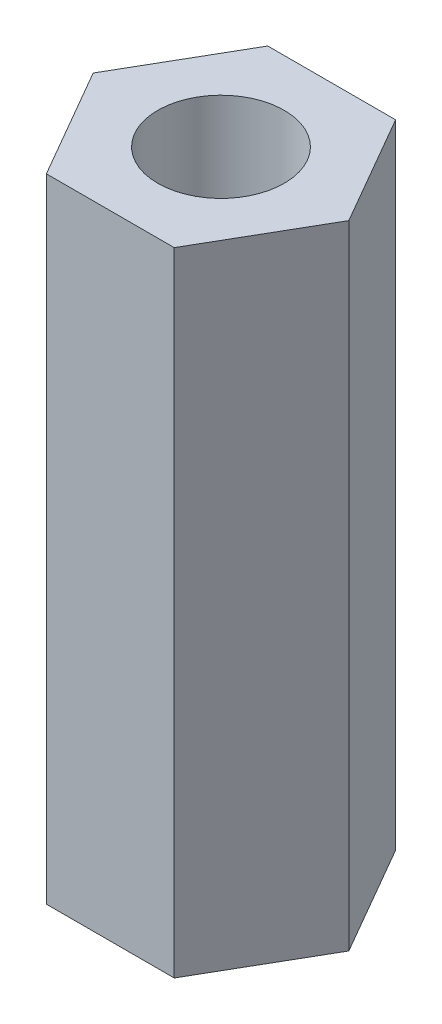
ISO-10303-21;
HEADER;
FILE_DESCRIPTION(('STEP AP214'),'2;1');
FILE_NAME('part.step','',(''),(''),'','','');
FILE_SCHEMA(('AUTOMOTIVE_DESIGN { 1 0 10303 214 1 1 1 1 }'));
ENDSEC;
DATA;
#1=APPLICATION_CONTEXT('core data for automotive mechanical design processes');
#2=APPLICATION_PROTOCOL_DEFINITION('international standard','automotive_design',2000,#1);
#3=PRODUCT_CONTEXT('',#1,'mechanical');
#4=PRODUCT('Part','Part','',(#3));
#5=PRODUCT_RELATED_PRODUCT_CATEGORY('part','',(#4));
#6=PRODUCT_DEFINITION_FORMATION('','',#4);
#7=PRODUCT_DEFINITION_CONTEXT('part definition',#1,'design');
#8=PRODUCT_DEFINITION('design','',#6,#7);
#9=PRODUCT_DEFINITION_SHAPE('','',#8);
#10=(LENGTH_UNIT() NAMED_UNIT(*) SI_UNIT(.MILLI.,.METRE.));
#11=(NAMED_UNIT(*) PLANE_ANGLE_UNIT() SI_UNIT($,.RADIAN.));
#12=(NAMED_UNIT(*) SI_UNIT($,.STERADIAN.) SOLID_ANGLE_UNIT());
#13=UNCERTAINTY_MEASURE_WITH_UNIT(LENGTH_MEASURE(1.E-05),#10,'distance_accuracy_value','');
#14=(GEOMETRIC_REPRESENTATION_CONTEXT(3) GLOBAL_UNCERTAINTY_ASSIGNED_CONTEXT((#13)) GLOBAL_UNIT_ASSIGNED_CONTEXT((#10,
#11,#12)) REPRESENTATION_CONTEXT('',''));
#15=CARTESIAN_POINT('',(0.,0.,0.));
#16=DIRECTION('',(0.,0.,1.));
#17=DIRECTION('',(1.,0.,0.));
#18=AXIS2_PLACEMENT_3D('',#15,#16,#17);
#19=CARTESIAN_POINT('',(0.,20.,0.));
#20=DIRECTION('',(0.,1.,0.));
#21=DIRECTION('',(0.,0.,1.));
#22=AXIS2_PLACEMENT_3D('',#19,#20,#21);
#23=PLANE('',#22);
#24=DIRECTION('',(-0.5,0.,-0.866025403784438));
#25=VECTOR('',#24,1.);
#26=CARTESIAN_POINT('',(4.04145188432738,20.,0.));
#27=LINE('',#26,#25);
#28=CARTESIAN_POINT('',(4.04145188432738,20.,0.));
#29=VERTEX_POINT('',#28);
#30=CARTESIAN_POINT('',(2.02072594216369,20.,-3.5));
#31=VERTEX_POINT('',#30);
#32=EDGE_CURVE('E137',#29,#31,#27,.T.);
#33=ORIENTED_EDGE('',*,*,#32,.T.);
#34=DIRECTION('',(-1.,0.,0.));
#35=VECTOR('',#34,1.);
#36=CARTESIAN_POINT('',(2.02072594216369,20.,-3.5));
#37=LINE('',#36,#35);
#38=CARTESIAN_POINT('',(-2.02072594216369,20.,-3.5));
#39=VERTEX_POINT('',#38);
#40=EDGE_CURVE('E95',#31,#39,#37,.T.);
#41=ORIENTED_EDGE('',*,*,#40,.T.);
#42=DIRECTION('',(-0.5,0.,0.866025403784439));
#43=VECTOR('',#42,1.);
#44=CARTESIAN_POINT('',(-2.02072594216369,20.,-3.5));
#45=LINE('',#44,#43);
#46=CARTESIAN_POINT('',(-4.04145188432738,20.,0.));
#47=VERTEX_POINT('',#46);
#48=EDGE_CURVE('E108',#39,#47,#45,.T.);
#49=ORIENTED_EDGE('',*,*,#48,.T.);
#50=DIRECTION('',(0.5,0.,0.866025403784438));
#51=VECTOR('',#50,1.);
#52=CARTESIAN_POINT('',(-4.04145188432738,20.,0.));
#53=LINE('',#52,#51);
#54=CARTESIAN_POINT('',(-2.02072594216369,20.,3.5));
#55=VERTEX_POINT('',#54);
#56=EDGE_CURVE('E102',#47,#55,#53,.T.);
#57=ORIENTED_EDGE('',*,*,#56,.T.);
#58=DIRECTION('',(1.,0.,0.));
#59=VECTOR('',#58,1.);
#60=CARTESIAN_POINT('',(-2.02072594216369,20.,3.5));
#61=LINE('',#60,#59);
#62=CARTESIAN_POINT('',(2.02072594216369,20.,3.5));
#63=VERTEX_POINT('',#62);
#64=EDGE_CURVE('E106',#55,#63,#61,.T.);
#65=ORIENTED_EDGE('',*,*,#64,.T.);
#66=DIRECTION('',(0.5,0.,-0.866025403784439));
#67=VECTOR('',#66,1.);
#68=CARTESIAN_POINT('',(2.02072594216369,20.,3.5));
#69=LINE('',#68,#67);
#70=EDGE_CURVE('E58',#63,#29,#69,.T.);
#71=ORIENTED_EDGE('',*,*,#70,.T.);
#72=EDGE_LOOP('',(#33,#41,#49,#57,#65,#71));
#73=FACE_BOUND('',#72,.T.);
#74=CARTESIAN_POINT('',(0.,20.,0.));
#75=DIRECTION('',(0.,1.,0.));
#76=DIRECTION('',(0.,0.,1.));
#77=AXIS2_PLACEMENT_3D('',#74,#75,#76);
#78=CIRCLE('',#77,2.);
#79=CARTESIAN_POINT('',(0.,20.,2.));
#80=VERTEX_POINT('',#79);
#81=EDGE_CURVE('E130',#80,#80,#78,.T.);
#82=ORIENTED_EDGE('',*,*,#81,.F.);
#83=EDGE_LOOP('',(#82));
#84=FACE_BOUND('',#83,.T.);
#85=ADVANCED_FACE('F41',(#73,#84),#23,.T.);
#86=CARTESIAN_POINT('',(0.,0.,0.));
#87=DIRECTION('',(0.,1.,0.));
#88=DIRECTION('',(0.,0.,1.));
#89=AXIS2_PLACEMENT_3D('',#86,#87,#88);
#90=PLANE('',#89);
#91=DIRECTION('',(-0.5,0.,-0.866025403784438));
#92=VECTOR('',#91,1.);
#93=CARTESIAN_POINT('',(4.04145188432738,0.,0.));
#94=LINE('',#93,#92);
#95=CARTESIAN_POINT('',(4.04145188432738,0.,0.));
#96=VERTEX_POINT('',#95);
#97=CARTESIAN_POINT('',(2.02072594216369,0.,-3.5));
#98=VERTEX_POINT('',#97);
#99=EDGE_CURVE('E126',#96,#98,#94,.T.);
#100=ORIENTED_EDGE('',*,*,#99,.F.);
#101=DIRECTION('',(0.5,0.,-0.866025403784439));
#102=VECTOR('',#101,1.);
#103=CARTESIAN_POINT('',(2.02072594216369,0.,3.5));
#104=LINE('',#103,#102);
#105=CARTESIAN_POINT('',(2.02072594216369,0.,3.5));
#106=VERTEX_POINT('',#105);
#107=EDGE_CURVE('E87',#106,#96,#104,.T.);
#108=ORIENTED_EDGE('',*,*,#107,.F.);
#109=DIRECTION('',(1.,0.,0.));
#110=VECTOR('',#109,1.);
#111=CARTESIAN_POINT('',(-2.02072594216369,0.,3.5));
#112=LINE('',#111,#110);
#113=CARTESIAN_POINT('',(-2.02072594216369,0.,3.5));
#114=VERTEX_POINT('',#113);
#115=EDGE_CURVE('E81',#114,#106,#112,.T.);
#116=ORIENTED_EDGE('',*,*,#115,.F.);
#117=DIRECTION('',(0.5,0.,0.866025403784438));
#118=VECTOR('',#117,1.);
#119=CARTESIAN_POINT('',(-4.04145188432738,0.,0.));
#120=LINE('',#119,#118);
#121=CARTESIAN_POINT('',(-4.04145188432738,0.,0.));
#122=VERTEX_POINT('',#121);
#123=EDGE_CURVE('E116',#122,#114,#120,.T.);
#124=ORIENTED_EDGE('',*,*,#123,.F.);
#125=DIRECTION('',(-0.5,0.,0.866025403784439));
#126=VECTOR('',#125,1.);
#127=CARTESIAN_POINT('',(-2.02072594216369,0.,-3.5));
#128=LINE('',#127,#126);
#129=CARTESIAN_POINT('',(-2.02072594216369,0.,-3.5));
#130=VERTEX_POINT('',#129);
#131=EDGE_CURVE('E132',#130,#122,#128,.T.);
#132=ORIENTED_EDGE('',*,*,#131,.F.);
#133=DIRECTION('',(-1.,0.,0.));
#134=VECTOR('',#133,1.);
#135=CARTESIAN_POINT('',(2.02072594216369,0.,-3.5));
#136=LINE('',#135,#134);
#137=EDGE_CURVE('E129',#98,#130,#136,.T.);
#138=ORIENTED_EDGE('',*,*,#137,.F.);
#139=EDGE_LOOP('',(#100,#108,#116,#124,#132,#138));
#140=FACE_BOUND('',#139,.T.);
#141=CARTESIAN_POINT('',(0.,0.,0.));
#142=DIRECTION('',(0.,1.,0.));
#143=DIRECTION('',(0.,0.,1.));
#144=AXIS2_PLACEMENT_3D('',#141,#142,#143);
#145=CIRCLE('',#144,2.);
#146=CARTESIAN_POINT('',(0.,0.,2.));
#147=VERTEX_POINT('',#146);
#148=EDGE_CURVE('E230',#147,#147,#145,.T.);
#149=ORIENTED_EDGE('',*,*,#148,.T.);
#150=EDGE_LOOP('',(#149));
#151=FACE_BOUND('',#150,.T.);
#152=ADVANCED_FACE('F146',(#140,#151),#90,.F.);
#153=CARTESIAN_POINT('',(4.04145188432738,20.,0.));
#154=DIRECTION('',(-0.866025403784438,0.,0.5));
#155=DIRECTION('',(0.5,0.,0.866025403784439));
#156=AXIS2_PLACEMENT_3D('',#153,#154,#155);
#157=PLANE('',#156);
#158=ORIENTED_EDGE('',*,*,#99,.T.);
#159=DIRECTION('',(0.,-1.,0.));
#160=VECTOR('',#159,1.);
#161=CARTESIAN_POINT('',(2.02072594216369,20.,-3.5));
#162=LINE('',#161,#160);
#163=EDGE_CURVE('E11',#31,#98,#162,.T.);
#164=ORIENTED_EDGE('',*,*,#163,.F.);
#165=ORIENTED_EDGE('',*,*,#32,.F.);
#166=DIRECTION('',(0.,-1.,0.));
#167=VECTOR('',#166,1.);
#168=CARTESIAN_POINT('',(4.04145188432738,20.,0.));
#169=LINE('',#168,#167);
#170=EDGE_CURVE('E122',#29,#96,#169,.T.);
#171=ORIENTED_EDGE('',*,*,#170,.T.);
#172=EDGE_LOOP('',(#158,#164,#165,#171));
#173=FACE_BOUND('',#172,.T.);
#174=ADVANCED_FACE('F43',(#173),#157,.F.);
#175=CARTESIAN_POINT('',(2.02072594216369,20.,-3.5));
#176=DIRECTION('',(0.,0.,1.));
#177=DIRECTION('',(1.,0.,0.));
#178=AXIS2_PLACEMENT_3D('',#175,#176,#177);
#179=PLANE('',#178);
#180=ORIENTED_EDGE('',*,*,#137,.T.);
#181=DIRECTION('',(0.,-1.,0.));
#182=VECTOR('',#181,1.);
#183=CARTESIAN_POINT('',(-2.02072594216369,20.,-3.5));
#184=LINE('',#183,#182);
#185=EDGE_CURVE('E50',#39,#130,#184,.T.);
#186=ORIENTED_EDGE('',*,*,#185,.F.);
#187=ORIENTED_EDGE('',*,*,#40,.F.);
#188=ORIENTED_EDGE('',*,*,#163,.T.);
#189=EDGE_LOOP('',(#180,#186,#187,#188));
#190=FACE_BOUND('',#189,.T.);
#191=ADVANCED_FACE('F171',(#190),#179,.F.);
#192=CARTESIAN_POINT('',(-2.02072594216369,20.,-3.5));
#193=DIRECTION('',(0.866025403784439,0.,0.5));
#194=DIRECTION('',(0.5,0.,-0.866025403784439));
#195=AXIS2_PLACEMENT_3D('',#192,#193,#194);
#196=PLANE('',#195);
#197=ORIENTED_EDGE('',*,*,#131,.T.);
#198=DIRECTION('',(0.,-1.,0.));
#199=VECTOR('',#198,1.);
#200=CARTESIAN_POINT('',(-4.04145188432738,20.,0.));
#201=LINE('',#200,#199);
#202=EDGE_CURVE('E117',#47,#122,#201,.T.);
#203=ORIENTED_EDGE('',*,*,#202,.F.);
#204=ORIENTED_EDGE('',*,*,#48,.F.);
#205=ORIENTED_EDGE('',*,*,#185,.T.);
#206=EDGE_LOOP('',(#197,#203,#204,#205));
#207=FACE_BOUND('',#206,.T.);
#208=ADVANCED_FACE('F143',(#207),#196,.F.);
#209=CARTESIAN_POINT('',(-4.04145188432738,20.,0.));
#210=DIRECTION('',(0.866025403784439,0.,-0.5));
#211=DIRECTION('',(-0.5,0.,-0.866025403784439));
#212=AXIS2_PLACEMENT_3D('',#209,#210,#211);
#213=PLANE('',#212);
#214=ORIENTED_EDGE('',*,*,#123,.T.);
#215=DIRECTION('',(0.,-1.,0.));
#216=VECTOR('',#215,1.);
#217=CARTESIAN_POINT('',(-2.02072594216369,20.,3.5));
#218=LINE('',#217,#216);
#219=EDGE_CURVE('E113',#55,#114,#218,.T.);
#220=ORIENTED_EDGE('',*,*,#219,.F.);
#221=ORIENTED_EDGE('',*,*,#56,.F.);
#222=ORIENTED_EDGE('',*,*,#202,.T.);
#223=EDGE_LOOP('',(#214,#220,#221,#222));
#224=FACE_BOUND('',#223,.T.);
#225=ADVANCED_FACE('F114',(#224),#213,.F.);
#226=CARTESIAN_POINT('',(-2.02072594216369,20.,3.5));
#227=DIRECTION('',(0.,0.,-1.));
#228=DIRECTION('',(-1.,0.,0.));
#229=AXIS2_PLACEMENT_3D('',#226,#227,#228);
#230=PLANE('',#229);
#231=ORIENTED_EDGE('',*,*,#115,.T.);
#232=DIRECTION('',(0.,-1.,0.));
#233=VECTOR('',#232,1.);
#234=CARTESIAN_POINT('',(2.02072594216369,20.,3.5));
#235=LINE('',#234,#233);
#236=EDGE_CURVE('E118',#63,#106,#235,.T.);
#237=ORIENTED_EDGE('',*,*,#236,.F.);
#238=ORIENTED_EDGE('',*,*,#64,.F.);
#239=ORIENTED_EDGE('',*,*,#219,.T.);
#240=EDGE_LOOP('',(#231,#237,#238,#239));
#241=FACE_BOUND('',#240,.T.);
#242=ADVANCED_FACE('F120',(#241),#230,.F.);
#243=CARTESIAN_POINT('',(2.02072594216369,20.,3.5));
#244=DIRECTION('',(-0.866025403784439,0.,-0.5));
#245=DIRECTION('',(-0.5,0.,0.866025403784439));
#246=AXIS2_PLACEMENT_3D('',#243,#244,#245);
#247=PLANE('',#246);
#248=ORIENTED_EDGE('',*,*,#107,.T.);
#249=ORIENTED_EDGE('',*,*,#170,.F.);
#250=ORIENTED_EDGE('',*,*,#70,.F.);
#251=ORIENTED_EDGE('',*,*,#236,.T.);
#252=EDGE_LOOP('',(#248,#249,#250,#251));
#253=FACE_BOUND('',#252,.T.);
#254=ADVANCED_FACE('F151',(#253),#247,.F.);
#255=CARTESIAN_POINT('',(0.,20.,0.));
#256=DIRECTION('',(0.,-1.,0.));
#257=DIRECTION('',(0.,0.,-1.));
#258=AXIS2_PLACEMENT_3D('',#255,#256,#257);
#259=CYLINDRICAL_SURFACE('',#258,2.);
#260=ORIENTED_EDGE('',*,*,#81,.T.);
#261=EDGE_LOOP('',(#260));
#262=FACE_BOUND('',#261,.T.);
#263=ORIENTED_EDGE('',*,*,#148,.F.);
#264=EDGE_LOOP('',(#263));
#265=FACE_BOUND('',#264,.T.);
#266=ADVANCED_FACE('F153',(#262,#265),#259,.F.);
#267=CLOSED_SHELL('',(#85,#152,#174,#191,#208,#225,#242,#254,#266));
#268=MANIFOLD_SOLID_BREP('B2',#267);
#269=ADVANCED_BREP_SHAPE_REPRESENTATION('',(#18,#268),#14);
#270=SHAPE_DEFINITION_REPRESENTATION(#9,#269);
ENDSEC;
END-ISO-10303-21;
